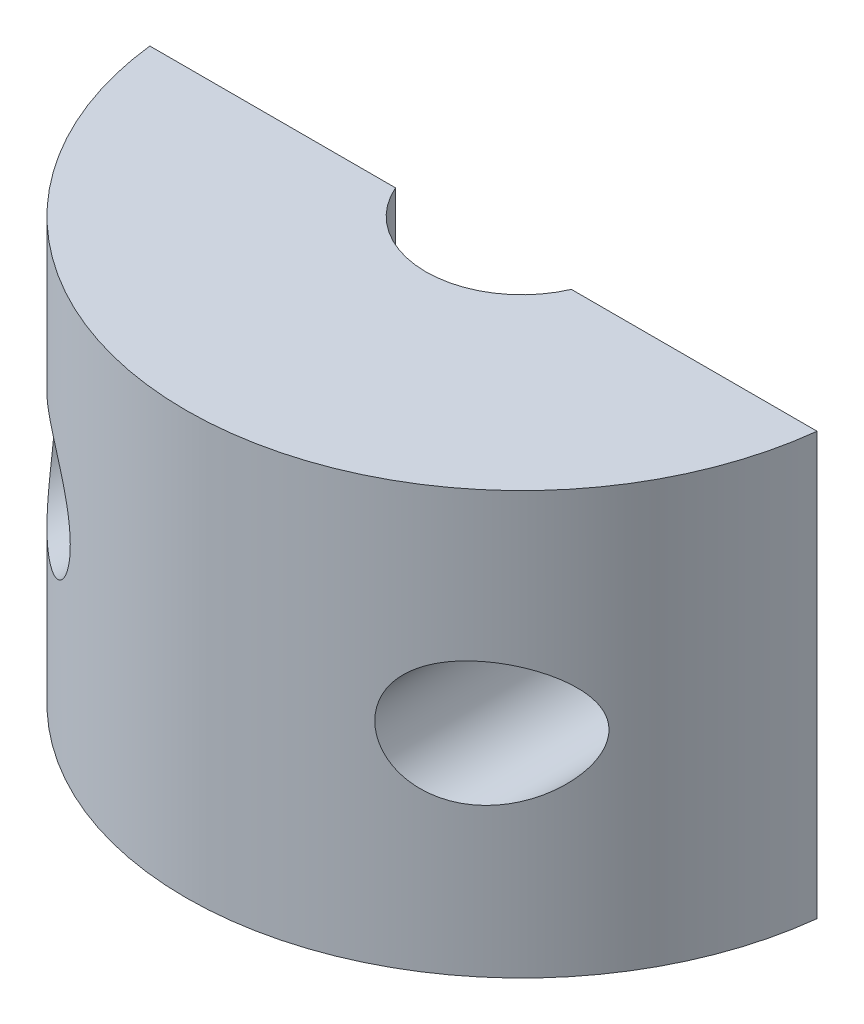
ISO-10303-21;
HEADER;
FILE_DESCRIPTION(('STEP AP214'),'2;1');
FILE_NAME('part.step','',(''),(''),'','','');
FILE_SCHEMA(('AUTOMOTIVE_DESIGN { 1 0 10303 214 1 1 1 1 }'));
ENDSEC;
DATA;
#1=APPLICATION_CONTEXT('core data for automotive mechanical design processes');
#2=APPLICATION_PROTOCOL_DEFINITION('international standard','automotive_design',2000,#1);
#3=PRODUCT_CONTEXT('',#1,'mechanical');
#4=PRODUCT('Part','Part','',(#3));
#5=PRODUCT_RELATED_PRODUCT_CATEGORY('part','',(#4));
#6=PRODUCT_DEFINITION_FORMATION('','',#4);
#7=PRODUCT_DEFINITION_CONTEXT('part definition',#1,'design');
#8=PRODUCT_DEFINITION('design','',#6,#7);
#9=PRODUCT_DEFINITION_SHAPE('','',#8);
#10=(LENGTH_UNIT() NAMED_UNIT(*) SI_UNIT(.MILLI.,.METRE.));
#11=(NAMED_UNIT(*) PLANE_ANGLE_UNIT() SI_UNIT($,.RADIAN.));
#12=(NAMED_UNIT(*) SI_UNIT($,.STERADIAN.) SOLID_ANGLE_UNIT());
#13=UNCERTAINTY_MEASURE_WITH_UNIT(LENGTH_MEASURE(1.E-05),#10,'distance_accuracy_value','');
#14=(GEOMETRIC_REPRESENTATION_CONTEXT(3) GLOBAL_UNCERTAINTY_ASSIGNED_CONTEXT((#13)) GLOBAL_UNIT_ASSIGNED_CONTEXT((#10,
#11,#12)) REPRESENTATION_CONTEXT('',''));
#15=CARTESIAN_POINT('',(0.,0.,0.));
#16=DIRECTION('',(0.,0.,1.));
#17=DIRECTION('',(1.,0.,0.));
#18=AXIS2_PLACEMENT_3D('',#15,#16,#17);
#19=CARTESIAN_POINT('',(0.,22.,0.));
#20=DIRECTION('',(0.,-1.,0.));
#21=DIRECTION('',(0.,0.,-1.));
#22=AXIS2_PLACEMENT_3D('',#19,#20,#21);
#23=CYLINDRICAL_SURFACE('',#22,17.5);
#24=CARTESIAN_POINT('',(-14.4351923476113,11.,9.89319068286191));
#25=CARTESIAN_POINT('',(-14.4351854063643,11.1107214320319,9.89320253763242));
#26=CARTESIAN_POINT('',(-14.4294784286159,11.2215070622987,9.90154375625472));
#27=CARTESIAN_POINT('',(-14.4071932160093,11.4396534645998,9.9339388034283));
#28=CARTESIAN_POINT('',(-14.3905997840602,11.5470092286437,9.95801459668769));
#29=CARTESIAN_POINT('',(-14.3425687854503,11.7817811831064,10.0271074274855));
#30=CARTESIAN_POINT('',(-14.3084640688859,11.9075374235435,10.0758457983632));
#31=CARTESIAN_POINT('',(-14.2283748609078,12.1479047446293,10.1886261603085));
#32=CARTESIAN_POINT('',(-14.1823661067574,12.2624923970377,10.2526993865471));
#33=CARTESIAN_POINT('',(-14.0926921173052,12.4551543024337,10.3754721567712));
#34=CARTESIAN_POINT('',(-14.0509354802768,12.5355530820995,10.4320005711661));
#35=CARTESIAN_POINT('',(-13.962666159549,12.6899860230746,10.5498516627541));
#36=CARTESIAN_POINT('',(-13.9161521533778,12.7640184040424,10.6111756719238));
#37=CARTESIAN_POINT('',(-13.8188947862182,12.9061858185024,10.7375285346047));
#38=CARTESIAN_POINT('',(-13.7681429101692,12.974308389331,10.8025647598407));
#39=CARTESIAN_POINT('',(-13.6629600269906,13.1048006896623,10.9352960283987));
#40=CARTESIAN_POINT('',(-13.6085300125415,13.1671719607038,11.0029903522855));
#41=CARTESIAN_POINT('',(-13.4683727042353,13.3161702380928,11.1745493874523));
#42=CARTESIAN_POINT('',(-13.3805511107422,13.3994200371177,11.2796481942207));
#43=CARTESIAN_POINT('',(-13.1981683269466,13.5543581876393,11.4925206327793));
#44=CARTESIAN_POINT('',(-13.1036040652739,13.6260412211883,11.600295468777));
#45=CARTESIAN_POINT('',(-12.9082612534243,13.7581596361268,11.8172804658417));
#46=CARTESIAN_POINT('',(-12.8074777447167,13.8185858842577,11.9264917161068));
#47=CARTESIAN_POINT('',(-12.6002695952139,13.9281025678747,12.1452006861663));
#48=CARTESIAN_POINT('',(-12.4938458595144,13.9771948154135,12.2546983573334));
#49=CARTESIAN_POINT('',(-12.273720261481,14.0646199896123,12.4751960410589));
#50=CARTESIAN_POINT('',(-12.1599182615054,14.1027297009474,12.5861848442722));
#51=CARTESIAN_POINT('',(-11.9274492318936,14.166398633305,12.8067024913441));
#52=CARTESIAN_POINT('',(-11.8087815824089,14.1919562498655,12.9162311468205));
#53=CARTESIAN_POINT('',(-11.5674239622345,14.2297510361998,13.1328190172241));
#54=CARTESIAN_POINT('',(-11.4447400583483,14.2420074211921,13.2398815751321));
#55=CARTESIAN_POINT('',(-11.1961268689162,14.2523623989087,13.4507749315319));
#56=CARTESIAN_POINT('',(-11.0701987148926,14.250465862983,13.5546068296421));
#57=CARTESIAN_POINT('',(-10.7527915399378,14.2267534099336,13.8089367537417));
#58=CARTESIAN_POINT('',(-10.5598815683915,14.1954932039982,13.956940188805));
#59=CARTESIAN_POINT('',(-10.1746365931386,14.0952890061681,14.2402184766604));
#60=CARTESIAN_POINT('',(-9.98230116910394,14.0263935048131,14.3755094462824));
#61=CARTESIAN_POINT('',(-9.63677139876624,13.8627060510807,14.6088551469129));
#62=CARTESIAN_POINT('',(-9.48236287193662,13.7740781832204,14.7093681878592));
#63=CARTESIAN_POINT('',(-9.259410784157,13.6195561896128,14.8499532052958));
#64=CARTESIAN_POINT('',(-9.18650510171574,13.564421604664,14.8951360251197));
#65=CARTESIAN_POINT('',(-9.04438253994854,13.4470217157696,14.981857394852));
#66=CARTESIAN_POINT('',(-8.9751640639982,13.3847595355862,15.0233975272263));
#67=CARTESIAN_POINT('',(-8.84076604869028,13.252798437034,15.1028806141716));
#68=CARTESIAN_POINT('',(-8.77561953121894,13.1830487437715,15.1407952213938));
#69=CARTESIAN_POINT('',(-8.65083504177582,13.0368511307601,15.2124365837774));
#70=CARTESIAN_POINT('',(-8.59119434513602,12.9604065610038,15.2461654132327));
#71=CARTESIAN_POINT('',(-8.47827425210696,12.8012803640893,15.3092472301404));
#72=CARTESIAN_POINT('',(-8.42499381273417,12.7185997631822,15.338600935242));
#73=CARTESIAN_POINT('',(-8.32562283337006,12.5476223779358,15.3927648329195));
#74=CARTESIAN_POINT('',(-8.27953125484091,12.4593264074195,15.4175756818687));
#75=CARTESIAN_POINT('',(-8.20041631975081,12.2889271572136,15.459784330797));
#76=CARTESIAN_POINT('',(-8.16648544205924,12.2073761214638,15.4777166616643));
#77=CARTESIAN_POINT('',(-8.10518339732691,12.0411044567527,15.5099065641261));
#78=CARTESIAN_POINT('',(-8.07781450742864,11.9563827392577,15.5241628601912));
#79=CARTESIAN_POINT('',(-8.03004534063454,11.7845315469674,15.548925998733));
#80=CARTESIAN_POINT('',(-8.00963931492149,11.6974041229846,15.5594359346754));
#81=CARTESIAN_POINT('',(-7.97603487735773,11.5213952062193,15.5766881114068));
#82=CARTESIAN_POINT('',(-7.96283898467137,11.4325131115926,15.5834290353514));
#83=CARTESIAN_POINT('',(-7.935849714781,11.1781041564069,15.597203738062));
#84=CARTESIAN_POINT('',(-7.93097083492752,11.0112669297195,15.5996732359099));
#85=CARTESIAN_POINT('',(-7.94678588648249,10.679246435926,15.591621087927));
#86=CARTESIAN_POINT('',(-7.96747446984696,10.5140628302107,15.5811021589354));
#87=CARTESIAN_POINT('',(-8.03278778712706,10.1930528328736,15.5475278933696));
#88=CARTESIAN_POINT('',(-8.07696145062517,10.0371097134103,15.5247086931686));
#89=CARTESIAN_POINT('',(-8.18697929547645,9.73548320717321,15.4669713431335));
#90=CARTESIAN_POINT('',(-8.25282434584583,9.58980023211254,15.4320527081126));
#91=CARTESIAN_POINT('',(-8.40541554355062,9.30835839640948,15.3494847336182));
#92=CARTESIAN_POINT('',(-8.49267882995274,9.17297452151927,15.3015166140438));
#93=CARTESIAN_POINT('',(-8.68345653237575,8.91936967475263,15.1940629680102));
#94=CARTESIAN_POINT('',(-8.78697470503784,8.80115268247385,15.1345747784225));
#95=CARTESIAN_POINT('',(-9.01460641692163,8.57541059941235,15.0001857732254));
#96=CARTESIAN_POINT('',(-9.13968151182539,8.46934786246623,14.9244646634116));
#97=CARTESIAN_POINT('',(-9.39947415453385,8.27977752804582,14.7622277628207));
#98=CARTESIAN_POINT('',(-9.53419565345356,8.19627924047403,14.6757075378761));
#99=CARTESIAN_POINT('',(-9.82701367482364,8.0421871567348,14.4815216770973));
#100=CARTESIAN_POINT('',(-9.98587360724224,7.97467775263719,14.3725691627529));
#101=CARTESIAN_POINT('',(-10.3057473036486,7.86669080919712,14.1449714206699));
#102=CARTESIAN_POINT('',(-10.4667622530218,7.82622882800746,14.0263206582868));
#103=CARTESIAN_POINT('',(-10.8166883897497,7.7652249368534,13.7588563913282));
#104=CARTESIAN_POINT('',(-11.0052943945565,7.74970348732925,13.6085042943301));
#105=CARTESIAN_POINT('',(-11.3760015204793,7.75030566434481,13.3001856294852));
#106=CARTESIAN_POINT('',(-11.5580986583065,7.76644834212918,13.1422145333223));
#107=CARTESIAN_POINT('',(-11.9504672227586,7.83386494298812,12.7874940529666));
#108=CARTESIAN_POINT('',(-12.1585824462431,7.89182927950208,12.5895919477833));
#109=CARTESIAN_POINT('',(-12.4578316436077,8.0076177544317,12.291155076363));
#110=CARTESIAN_POINT('',(-12.5555258196523,8.05108341829937,12.1913035980314));
#111=CARTESIAN_POINT('',(-12.746264878531,8.14746341470471,11.9917356548291));
#112=CARTESIAN_POINT('',(-12.8393113807686,8.20037442636145,11.892019154877));
#113=CARTESIAN_POINT('',(-13.0166878425667,8.31323236964329,11.6975406775821));
#114=CARTESIAN_POINT('',(-13.1012186813075,8.37280279853969,11.6027429300452));
#115=CARTESIAN_POINT('',(-13.2653357327723,8.50073374412333,11.4147462537791));
#116=CARTESIAN_POINT('',(-13.3449209404991,8.56909603879069,11.3215476527785));
#117=CARTESIAN_POINT('',(-13.4985179433951,8.71478413120341,11.1379667889636));
#118=CARTESIAN_POINT('',(-13.5725399447209,8.79209281946238,11.0475795564276));
#119=CARTESIAN_POINT('',(-13.7144904303988,8.95624923670396,10.8708595605261));
#120=CARTESIAN_POINT('',(-13.7824227555214,9.04309087523955,10.7845242582083));
#121=CARTESIAN_POINT('',(-13.9200270558531,9.23947509513177,10.6064661015993));
#122=CARTESIAN_POINT('',(-13.9887009008908,9.35049983555399,10.515583901735));
#123=CARTESIAN_POINT('',(-14.1149873661338,9.58694726919966,10.3454492906101));
#124=CARTESIAN_POINT('',(-14.172612227197,9.71235378011671,10.2661840324876));
#125=CARTESIAN_POINT('',(-14.2628104886524,9.94964661760273,10.1403605347467));
#126=CARTESIAN_POINT('',(-14.2981059311719,10.058681304546,10.090433081001));
#127=CARTESIAN_POINT('',(-14.3577496499499,10.2851616564625,10.0053859065639));
#128=CARTESIAN_POINT('',(-14.3821238566285,10.4025866226469,9.97023112342441));
#129=CARTESIAN_POINT('',(-14.4115369458183,10.6007423496649,9.92763876335556));
#130=CARTESIAN_POINT('',(-14.4203650256941,10.6797704720225,9.91479615307472));
#131=CARTESIAN_POINT('',(-14.4321951424213,10.83918780558,9.89756795996659));
#132=CARTESIAN_POINT('',(-14.4351973894186,10.9195769675798,9.89318207209364));
#133=CARTESIAN_POINT('',(-14.4351923476113,11.,9.89319068286191));
#134=B_SPLINE_CURVE_WITH_KNOTS('',3,(#24,#25,#26,#27,#28,#29,#30,#31,#32,#33,#34,#35,#36,#37,
#38,#39,#40,#41,#42,#43,#44,#45,#46,#47,#48,#49,#50,#51,#52,#53,#54,#55,#56,#57,#58,#59,#60,#61,
#62,#63,#64,#65,#66,#67,#68,#69,#70,#71,#72,#73,#74,#75,#76,#77,#78,#79,#80,#81,#82,#83,#84,#85,
#86,#87,#88,#89,#90,#91,#92,#93,#94,#95,#96,#97,#98,#99,#100,#101,#102,#103,#104,#105,#106,#107,
#108,#109,#110,#111,#112,#113,#114,#115,#116,#117,#118,#119,#120,#121,#122,#123,#124,#125,#126,
#127,#128,#129,#130,#131,#132,#133),.UNSPECIFIED.,.T.,.F.,(4,2,2,2,2,2,2,2,2,2,2,2,2,2,2,2,2,2,
2,2,2,2,2,2,2,2,2,2,2,2,2,2,2,2,2,2,2,2,2,2,2,2,2,2,2,2,2,2,2,2,2,2,2,2,4),(0.,
0.331841777553161,0.664147782553581,1.07918635593908,1.49507761526165,1.81501070213257,
2.13503296821189,2.45571447830309,2.77630978374778,3.25646192337981,3.73683419308992,
4.21759453411038,4.69827795901732,5.18813494026946,5.67805452083019,6.1672654080098,
6.65630791952205,7.38875217148992,8.12025493667895,8.73082685509704,9.03639611333956,
9.34183196086879,9.64948835243722,9.95699166851571,10.2644444893474,10.5718528528254,
10.8418867678276,11.1120142548696,11.3819181711904,11.651916329634,12.1500277791255,
12.6480350543751,13.1368055882578,13.6255957240829,14.1276060370096,14.6297325399713,
15.16943881887,15.709367437247,16.319419481259,16.929822136653,17.6522807491886,
18.3751741742021,19.2505064478331,19.68911988644,20.127579416002,20.5480973270221,
20.9687004135522,21.3885120144988,21.8080569486807,22.2841118195113,22.7596361960016,
23.1333765390797,23.5062247417869,23.7472682711249,23.9883031055268),.UNSPECIFIED.);
#135=CARTESIAN_POINT('',(-14.4351923476113,11.,9.89319068286191));
#136=VERTEX_POINT('',#135);
#137=EDGE_CURVE('E156',#136,#136,#134,.T.);
#138=ORIENTED_EDGE('',*,*,#137,.T.);
#139=EDGE_LOOP('',(#138));
#140=FACE_BOUND('',#139,.T.);
#141=CARTESIAN_POINT('',(7.93519234761125,11.,15.5975229573933));
#142=CARTESIAN_POINT('',(7.93520223225111,11.1663008509199,15.5975201691559));
#143=CARTESIAN_POINT('',(7.94801924887635,11.3326952487626,15.5910177749907));
#144=CARTESIAN_POINT('',(7.99871770765295,11.6606575606445,15.5650663881711));
#145=CARTESIAN_POINT('',(8.03661986040183,11.8222213711959,15.5456066977327));
#146=CARTESIAN_POINT('',(8.13562285875437,12.1355927563694,15.4940222551571));
#147=CARTESIAN_POINT('',(8.1966819168378,12.2874173322096,15.4619203124639));
#148=CARTESIAN_POINT('',(8.33924173363641,12.5777291413689,15.3854982028003));
#149=CARTESIAN_POINT('',(8.42074073091744,12.7162175225267,15.3411790886254));
#150=CARTESIAN_POINT('',(8.60338210872824,12.9807414338087,15.239521496784));
#151=CARTESIAN_POINT('',(8.70502768836727,13.1062964988478,15.1818412715208));
#152=CARTESIAN_POINT('',(8.92224709621971,13.3381279176726,15.0552085795871));
#153=CARTESIAN_POINT('',(9.03782484503702,13.4443988235921,14.9862529379851));
#154=CARTESIAN_POINT('',(9.29028571268866,13.6458106719126,14.8312005636125));
#155=CARTESIAN_POINT('',(9.42814987859592,13.7389414250228,14.7440985614854));
#156=CARTESIAN_POINT('',(9.710881668285,13.9009483680662,14.559441693929));
#157=CARTESIAN_POINT('',(9.85575276943386,13.9698123716014,14.461881608588));
#158=CARTESIAN_POINT('',(10.1705063195897,14.0928301443012,14.2426415094532));
#159=CARTESIAN_POINT('',(10.340869496489,14.1432062114129,14.1195418036492));
#160=CARTESIAN_POINT('',(10.680739260021,14.2153159065865,13.8642385951983));
#161=CARTESIAN_POINT('',(10.8502453571317,14.2370346816896,13.7320304089837));
#162=CARTESIAN_POINT('',(11.2182405218156,14.2560360633624,13.4338256065968));
#163=CARTESIAN_POINT('',(11.4158025535153,14.2476112572725,13.2663318893554));
#164=CARTESIAN_POINT('',(11.800994196086,14.1970444164128,12.9248946738883));
#165=CARTESIAN_POINT('',(11.9886128963881,14.1548661293861,12.7509444328217));
#166=CARTESIAN_POINT('',(12.2790581525692,14.0625300771634,12.4698811529349));
#167=CARTESIAN_POINT('',(12.3859825958537,14.0221840928671,12.363643424221));
#168=CARTESIAN_POINT('',(12.594811795476,13.9306103114868,12.1508402857757));
#169=CARTESIAN_POINT('',(12.6967153615086,13.8793799491768,12.0442748046447));
#170=CARTESIAN_POINT('',(12.8950461272085,13.7662140457282,11.831691016722));
#171=CARTESIAN_POINT('',(12.9914726364202,13.704277158852,11.7256727804424));
#172=CARTESIAN_POINT('',(13.1783170092118,13.5696703217789,11.5152848134878));
#173=CARTESIAN_POINT('',(13.2687369316276,13.4970040770197,11.410914527405));
#174=CARTESIAN_POINT('',(13.4797746745605,13.3076250769985,11.1616401902205));
#175=CARTESIAN_POINT('',(13.5971160426654,13.1852346410934,11.0181326589505));
#176=CARTESIAN_POINT('',(13.7611787911467,12.9834990895822,10.8114643636482));
#177=CARTESIAN_POINT('',(13.8138538379395,12.9132645460574,10.7440354651223));
#178=CARTESIAN_POINT('',(13.9147567683611,12.7663298726328,10.6130278597404));
#179=CARTESIAN_POINT('',(13.9629864533935,12.689632386059,10.5494475969107));
#180=CARTESIAN_POINT('',(14.0694229437574,12.5029229528564,10.4072849492391));
#181=CARTESIAN_POINT('',(14.1256822967263,12.3902598545314,10.3306605689882));
#182=CARTESIAN_POINT('',(14.2268551678788,12.1521501120007,10.190879805641));
#183=CARTESIAN_POINT('',(14.2717868438797,12.0267243847342,10.1277018940458));
#184=CARTESIAN_POINT('',(14.33863206264,11.7934225841623,10.0327577056476));
#185=CARTESIAN_POINT('',(14.3634525871098,11.6879838479109,9.99711947063219));
#186=CARTESIAN_POINT('',(14.4027017087785,11.4713829241865,9.94049239841689));
#187=CARTESIAN_POINT('',(14.4171429716588,11.3602278904268,9.91948570750029));
#188=CARTESIAN_POINT('',(14.4343974593198,11.1343634276012,9.89436336448938));
#189=CARTESIAN_POINT('',(14.4371383728595,11.0196362964191,9.89035275375021));
#190=CARTESIAN_POINT('',(14.4304955065021,10.7912789512582,9.9000417396064));
#191=CARTESIAN_POINT('',(14.4211081214528,10.6776490735564,9.91374660214931));
#192=CARTESIAN_POINT('',(14.3924440191833,10.4646341227199,9.95530531812541));
#193=CARTESIAN_POINT('',(14.3740769571899,10.3648597651408,9.98185571323572));
#194=CARTESIAN_POINT('',(14.3292477547152,10.1709439515683,10.0461035060648));
#195=CARTESIAN_POINT('',(14.3027823737268,10.0768047685274,10.0838053657916));
#196=CARTESIAN_POINT('',(14.2240573851278,9.83710527854222,10.194765265026));
#197=CARTESIAN_POINT('',(14.1660898320053,9.6968508288238,10.2753993274064));
#198=CARTESIAN_POINT('',(14.0363775670007,9.4331644921972,10.4518974794019));
#199=CARTESIAN_POINT('',(13.9645869580213,9.30979105797705,10.5478121171346));
#200=CARTESIAN_POINT('',(13.8261002536034,9.1025696098547,10.7284272203556));
#201=CARTESIAN_POINT('',(13.7613944971722,9.01581174880905,10.8113753131008));
#202=CARTESIAN_POINT('',(13.6260309519433,8.85147702370634,10.9814888234531));
#203=CARTESIAN_POINT('',(13.5553697073546,8.77390555389857,11.0686566770008));
#204=CARTESIAN_POINT('',(13.4087402512968,8.62743287967754,11.2458402734161));
#205=CARTESIAN_POINT('',(13.3327691802379,8.55853640398308,11.3358575363235));
#206=CARTESIAN_POINT('',(13.1760314393383,8.42912745025592,11.5176649429422));
#207=CARTESIAN_POINT('',(13.0952656055262,8.36861351671702,11.6094547757109));
#208=CARTESIAN_POINT('',(12.9251302489491,8.25296261617052,11.7986428918323));
#209=CARTESIAN_POINT('',(12.8355325173118,8.19824448339243,11.8960925280111));
#210=CARTESIAN_POINT('',(12.6517721793507,8.09782619476383,12.0913479220159));
#211=CARTESIAN_POINT('',(12.5576078483503,8.05212947961367,12.1891538012822));
#212=CARTESIAN_POINT('',(12.2686255655355,7.92875196510571,12.4822188824029));
#213=CARTESIAN_POINT('',(12.0672905901719,7.86476500226431,12.6771565782291));
#214=CARTESIAN_POINT('',(11.7357001692838,7.79448137031678,12.9827467305139));
#215=CARTESIAN_POINT('',(11.6098529770485,7.77530493379413,13.0954227179303));
#216=CARTESIAN_POINT('',(11.3540589431672,7.75184983148799,13.3178078547708));
#217=CARTESIAN_POINT('',(11.2241110341395,7.7475750773045,13.4275162177142));
#218=CARTESIAN_POINT('',(10.9615670810603,7.75504979463264,13.6426830181417));
#219=CARTESIAN_POINT('',(10.8289765711799,7.7667686644202,13.7481491754001));
#220=CARTESIAN_POINT('',(10.5625196069028,7.80736351222349,13.9539065472053));
#221=CARTESIAN_POINT('',(10.4286540328137,7.83622839337043,14.0542010632423));
#222=CARTESIAN_POINT('',(10.122663537861,7.92336946067184,14.2767994559453));
#223=CARTESIAN_POINT('',(9.95071355814063,7.98775126084035,14.3970402097561));
#224=CARTESIAN_POINT('',(9.61342486039852,8.14923057611804,14.6244085490398));
#225=CARTESIAN_POINT('',(9.44808180086689,8.24630619855593,14.7315448443424));
#226=CARTESIAN_POINT('',(9.20993860894632,8.41725390890858,14.8807265683768));
#227=CARTESIAN_POINT('',(9.13185942319227,8.47880887627705,14.9287313950096));
#228=CARTESIAN_POINT('',(8.98030017584483,8.61023204747677,15.0203867004276));
#229=CARTESIAN_POINT('',(8.90681778079971,8.68009598033652,15.0640393952623));
#230=CARTESIAN_POINT('',(8.7655313753115,8.82785971078159,15.1466884229079));
#231=CARTESIAN_POINT('',(8.69772715230918,8.90575920731619,15.1856849300438));
#232=CARTESIAN_POINT('',(8.56890107359257,9.06911099296576,15.2587488750279));
#233=CARTESIAN_POINT('',(8.50787787425827,9.15456177979128,15.2928172897538));
#234=CARTESIAN_POINT('',(8.40149159831192,9.32016942322888,15.3514856423518));
#235=CARTESIAN_POINT('',(8.35512813421801,9.39945284237414,15.3767432909116));
#236=CARTESIAN_POINT('',(8.2688896292563,9.56257627453449,15.4232897188728));
#237=CARTESIAN_POINT('',(8.22901358301815,9.64641557882178,15.4445791133184));
#238=CARTESIAN_POINT('',(8.15637213462928,9.81788190282446,15.4830644257194));
#239=CARTESIAN_POINT('',(8.12359665823485,9.90550334182137,15.5002661466445));
#240=CARTESIAN_POINT('',(8.06557964082688,10.0838592566416,15.5305342098214));
#241=CARTESIAN_POINT('',(8.04033575995389,10.1745927558458,15.5436018364988));
#242=CARTESIAN_POINT('',(7.99134399574869,10.3860964595433,15.5688603967501));
#243=CARTESIAN_POINT('',(7.97033164153044,10.5076899450158,15.5796044940331));
#244=CARTESIAN_POINT('',(7.94225297255541,10.752838550182,15.5939363853849));
#245=CARTESIAN_POINT('',(7.93518500064717,10.8763934350236,15.5975250298088));
#246=CARTESIAN_POINT('',(7.93519234761125,11.,15.5975229573933));
#247=B_SPLINE_CURVE_WITH_KNOTS('',3,(#141,#142,#143,#144,#145,#146,#147,#148,#149,#150,#151,
#152,#153,#154,#155,#156,#157,#158,#159,#160,#161,#162,#163,#164,#165,#166,#167,#168,#169,#170,
#171,#172,#173,#174,#175,#176,#177,#178,#179,#180,#181,#182,#183,#184,#185,#186,#187,#188,#189,
#190,#191,#192,#193,#194,#195,#196,#197,#198,#199,#200,#201,#202,#203,#204,#205,#206,#207,#208,
#209,#210,#211,#212,#213,#214,#215,#216,#217,#218,#219,#220,#221,#222,#223,#224,#225,#226,#227,
#228,#229,#230,#231,#232,#233,#234,#235,#236,#237,#238,#239,#240,#241,#242,#243,#244,#245,#246),
.UNSPECIFIED.,.T.,.F.,(4,2,2,2,2,2,2,2,2,2,2,2,2,2,2,2,2,2,2,2,2,2,2,2,2,2,2,2,2,2,2,2,2,2,2,2,
2,2,2,2,2,2,2,2,2,2,2,2,2,2,2,2,4),(0.,0.498453678896544,0.997319401514348,1.4952891525275,
1.993216005188,2.50565227741341,3.01823309069454,3.57940669399388,4.14086171000066,
4.78687945877223,5.43323190458346,6.20790612524668,6.98341348786526,7.45111455428762,
7.91892597084045,8.38679623093471,8.8545052859896,9.51874916600297,9.8505730893743,
10.1822619503306,10.6232210619989,11.0634687739221,11.4042507151125,11.7446160950899,
12.0870820046557,12.4296497360733,12.7430622838152,13.0566004065857,13.5692306301292,
14.083593258323,14.4921380041935,14.9009214703756,15.3099268075874,15.7188610377284,
16.1481954724954,16.5776933371621,17.4365531597467,17.9459802968659,18.4555411454111,
18.9641283810655,19.4723868180258,20.1281956423716,20.7835661895905,21.1143762932074,
21.4450170829442,21.7756454897887,22.1062082672995,22.3915774736711,22.6769024134943,
22.9618198457459,23.2466486695999,23.617178766176,23.9876648262741),.UNSPECIFIED.);
#248=CARTESIAN_POINT('',(7.93519234761125,11.,15.5975229573933));
#249=VERTEX_POINT('',#248);
#250=EDGE_CURVE('E102',#249,#249,#247,.T.);
#251=ORIENTED_EDGE('',*,*,#250,.T.);
#252=EDGE_LOOP('',(#251));
#253=FACE_BOUND('',#252,.T.);
#254=CARTESIAN_POINT('',(0.,22.,0.));
#255=DIRECTION('',(0.,1.,0.));
#256=DIRECTION('',(0.,0.,1.));
#257=AXIS2_PLACEMENT_3D('',#254,#255,#256);
#258=CIRCLE('',#257,17.5);
#259=CARTESIAN_POINT('',(-17.3853386507137,22.,2.));
#260=VERTEX_POINT('',#259);
#261=CARTESIAN_POINT('',(17.3853386507137,22.,2.));
#262=VERTEX_POINT('',#261);
#263=EDGE_CURVE('E42',#260,#262,#258,.T.);
#264=ORIENTED_EDGE('',*,*,#263,.F.);
#265=DIRECTION('',(0.,-1.,0.));
#266=VECTOR('',#265,1.);
#267=CARTESIAN_POINT('',(-17.3853386507137,22.,2.));
#268=LINE('',#267,#266);
#269=CARTESIAN_POINT('',(-17.3853386507137,0.,2.));
#270=VERTEX_POINT('',#269);
#271=EDGE_CURVE('E74',#260,#270,#268,.T.);
#272=ORIENTED_EDGE('',*,*,#271,.T.);
#273=CARTESIAN_POINT('',(0.,0.,0.));
#274=DIRECTION('',(0.,1.,0.));
#275=DIRECTION('',(0.,0.,1.));
#276=AXIS2_PLACEMENT_3D('',#273,#274,#275);
#277=CIRCLE('',#276,17.5);
#278=CARTESIAN_POINT('',(17.3853386507137,0.,2.));
#279=VERTEX_POINT('',#278);
#280=EDGE_CURVE('E96',#270,#279,#277,.T.);
#281=ORIENTED_EDGE('',*,*,#280,.T.);
#282=DIRECTION('',(0.,-1.,0.));
#283=VECTOR('',#282,1.);
#284=CARTESIAN_POINT('',(17.3853386507137,22.,2.));
#285=LINE('',#284,#283);
#286=EDGE_CURVE('E58',#279,#262,#285,.F.);
#287=ORIENTED_EDGE('',*,*,#286,.T.);
#288=EDGE_LOOP('',(#264,#272,#281,#287));
#289=FACE_BOUND('',#288,.T.);
#290=ADVANCED_FACE('F33',(#140,#253,#289),#23,.T.);
#291=CARTESIAN_POINT('',(0.,22.,0.));
#292=DIRECTION('',(0.,-1.,0.));
#293=DIRECTION('',(0.,0.,-1.));
#294=AXIS2_PLACEMENT_3D('',#291,#292,#293);
#295=CYLINDRICAL_SURFACE('',#294,5.);
#296=CARTESIAN_POINT('',(0.,0.,0.));
#297=DIRECTION('',(0.,-1.,0.));
#298=DIRECTION('',(0.,0.,1.));
#299=AXIS2_PLACEMENT_3D('',#296,#297,#298);
#300=CIRCLE('',#299,5.);
#301=CARTESIAN_POINT('',(4.58257569495584,0.,2.));
#302=VERTEX_POINT('',#301);
#303=CARTESIAN_POINT('',(-4.58257569495584,0.,2.));
#304=VERTEX_POINT('',#303);
#305=EDGE_CURVE('E93',#302,#304,#300,.T.);
#306=ORIENTED_EDGE('',*,*,#305,.T.);
#307=DIRECTION('',(0.,-1.,0.));
#308=VECTOR('',#307,1.);
#309=CARTESIAN_POINT('',(-4.58257569495584,22.,2.));
#310=LINE('',#309,#308);
#311=CARTESIAN_POINT('',(-4.58257569495584,22.,2.));
#312=VERTEX_POINT('',#311);
#313=EDGE_CURVE('E50',#304,#312,#310,.F.);
#314=ORIENTED_EDGE('',*,*,#313,.T.);
#315=CARTESIAN_POINT('',(0.,22.,0.));
#316=DIRECTION('',(0.,-1.,0.));
#317=DIRECTION('',(0.,0.,1.));
#318=AXIS2_PLACEMENT_3D('',#315,#316,#317);
#319=CIRCLE('',#318,5.);
#320=CARTESIAN_POINT('',(4.58257569495584,22.,2.));
#321=VERTEX_POINT('',#320);
#322=EDGE_CURVE('E11',#321,#312,#319,.T.);
#323=ORIENTED_EDGE('',*,*,#322,.F.);
#324=DIRECTION('',(0.,-1.,0.));
#325=VECTOR('',#324,1.);
#326=CARTESIAN_POINT('',(4.58257569495584,22.,2.));
#327=LINE('',#326,#325);
#328=EDGE_CURVE('E143',#321,#302,#327,.T.);
#329=ORIENTED_EDGE('',*,*,#328,.T.);
#330=EDGE_LOOP('',(#306,#314,#323,#329));
#331=FACE_BOUND('',#330,.T.);
#332=ADVANCED_FACE('F132',(#331),#295,.F.);
#333=CARTESIAN_POINT('',(0.,22.,0.));
#334=DIRECTION('',(0.,1.,0.));
#335=DIRECTION('',(0.,0.,1.));
#336=AXIS2_PLACEMENT_3D('',#333,#334,#335);
#337=PLANE('',#336);
#338=DIRECTION('',(1.,0.,0.));
#339=VECTOR('',#338,1.);
#340=CARTESIAN_POINT('',(-17.4714052096561,22.,2.));
#341=LINE('',#340,#339);
#342=EDGE_CURVE('E77',#260,#312,#341,.T.);
#343=ORIENTED_EDGE('',*,*,#342,.F.);
#344=ORIENTED_EDGE('',*,*,#263,.T.);
#345=EDGE_CURVE('E91',#321,#262,#341,.T.);
#346=ORIENTED_EDGE('',*,*,#345,.F.);
#347=ORIENTED_EDGE('',*,*,#322,.T.);
#348=EDGE_LOOP('',(#343,#344,#346,#347));
#349=FACE_BOUND('',#348,.T.);
#350=ADVANCED_FACE('F87',(#349),#337,.T.);
#351=CARTESIAN_POINT('',(0.,0.,0.));
#352=DIRECTION('',(0.,1.,0.));
#353=DIRECTION('',(0.,0.,1.));
#354=AXIS2_PLACEMENT_3D('',#351,#352,#353);
#355=PLANE('',#354);
#356=ORIENTED_EDGE('',*,*,#280,.F.);
#357=DIRECTION('',(1.,0.,0.));
#358=VECTOR('',#357,1.);
#359=CARTESIAN_POINT('',(-17.4714052096561,0.,2.));
#360=LINE('',#359,#358);
#361=EDGE_CURVE('E78',#270,#304,#360,.T.);
#362=ORIENTED_EDGE('',*,*,#361,.T.);
#363=ORIENTED_EDGE('',*,*,#305,.F.);
#364=EDGE_CURVE('E90',#302,#279,#360,.T.);
#365=ORIENTED_EDGE('',*,*,#364,.T.);
#366=EDGE_LOOP('',(#356,#362,#363,#365));
#367=FACE_BOUND('',#366,.T.);
#368=ADVANCED_FACE('F128',(#367),#355,.F.);
#369=CARTESIAN_POINT('',(-11.1851923476112,11.,23.));
#370=DIRECTION('',(0.,0.,-1.));
#371=DIRECTION('',(-1.,0.,0.));
#372=AXIS2_PLACEMENT_3D('',#369,#370,#371);
#373=CYLINDRICAL_SURFACE('',#372,1.75);
#374=CARTESIAN_POINT('',(-11.1851923476113,11.,2.));
#375=DIRECTION('',(0.,0.,1.));
#376=DIRECTION('',(1.,0.,0.));
#377=AXIS2_PLACEMENT_3D('',#374,#375,#376);
#378=CIRCLE('',#377,1.75);
#379=CARTESIAN_POINT('',(-9.43519234761125,11.,2.));
#380=VERTEX_POINT('',#379);
#381=EDGE_CURVE('E146',#380,#380,#378,.F.);
#382=ORIENTED_EDGE('',*,*,#381,.T.);
#383=EDGE_LOOP('',(#382));
#384=FACE_BOUND('',#383,.T.);
#385=CARTESIAN_POINT('',(-11.1851923476113,11.,5.));
#386=DIRECTION('',(0.,0.,-1.));
#387=DIRECTION('',(-1.,0.,0.));
#388=AXIS2_PLACEMENT_3D('',#385,#386,#387);
#389=CIRCLE('',#388,1.75);
#390=CARTESIAN_POINT('',(-12.9351923476113,11.,5.));
#391=VERTEX_POINT('',#390);
#392=EDGE_CURVE('E112',#391,#391,#389,.F.);
#393=ORIENTED_EDGE('',*,*,#392,.T.);
#394=EDGE_LOOP('',(#393));
#395=FACE_BOUND('',#394,.T.);
#396=ADVANCED_FACE('F124',(#384,#395),#373,.F.);
#397=CARTESIAN_POINT('',(11.1851923476113,11.,23.));
#398=DIRECTION('',(0.,0.,-1.));
#399=DIRECTION('',(-1.,0.,0.));
#400=AXIS2_PLACEMENT_3D('',#397,#398,#399);
#401=CYLINDRICAL_SURFACE('',#400,1.75);
#402=CARTESIAN_POINT('',(11.1851923476113,11.,2.));
#403=DIRECTION('',(0.,0.,1.));
#404=DIRECTION('',(1.,0.,0.));
#405=AXIS2_PLACEMENT_3D('',#402,#403,#404);
#406=CIRCLE('',#405,1.75);
#407=CARTESIAN_POINT('',(12.9351923476113,11.,2.));
#408=VERTEX_POINT('',#407);
#409=EDGE_CURVE('E37',#408,#408,#406,.F.);
#410=ORIENTED_EDGE('',*,*,#409,.T.);
#411=EDGE_LOOP('',(#410));
#412=FACE_BOUND('',#411,.T.);
#413=CARTESIAN_POINT('',(11.1851923476113,11.,5.));
#414=DIRECTION('',(0.,0.,-1.));
#415=DIRECTION('',(-1.,0.,0.));
#416=AXIS2_PLACEMENT_3D('',#413,#414,#415);
#417=CIRCLE('',#416,1.75);
#418=CARTESIAN_POINT('',(9.43519234761125,11.,5.));
#419=VERTEX_POINT('',#418);
#420=EDGE_CURVE('E104',#419,#419,#417,.F.);
#421=ORIENTED_EDGE('',*,*,#420,.T.);
#422=EDGE_LOOP('',(#421));
#423=FACE_BOUND('',#422,.T.);
#424=ADVANCED_FACE('F119',(#412,#423),#401,.F.);
#425=CARTESIAN_POINT('',(11.1851923476113,11.,27.));
#426=DIRECTION('',(0.,0.,-1.));
#427=DIRECTION('',(-1.,0.,0.));
#428=AXIS2_PLACEMENT_3D('',#425,#426,#427);
#429=CYLINDRICAL_SURFACE('',#428,3.25);
#430=CARTESIAN_POINT('',(11.1851923476113,11.,5.));
#431=DIRECTION('',(0.,0.,-1.));
#432=DIRECTION('',(-1.,0.,0.));
#433=AXIS2_PLACEMENT_3D('',#430,#431,#432);
#434=CIRCLE('',#433,3.25);
#435=CARTESIAN_POINT('',(7.93519234761125,11.,5.));
#436=VERTEX_POINT('',#435);
#437=EDGE_CURVE('E99',#436,#436,#434,.T.);
#438=ORIENTED_EDGE('',*,*,#437,.T.);
#439=EDGE_LOOP('',(#438));
#440=FACE_BOUND('',#439,.T.);
#441=ORIENTED_EDGE('',*,*,#250,.F.);
#442=EDGE_LOOP('',(#441));
#443=FACE_BOUND('',#442,.T.);
#444=ADVANCED_FACE('F113',(#440,#443),#429,.F.);
#445=CARTESIAN_POINT('',(11.1851923476113,11.,5.));
#446=DIRECTION('',(0.,0.,-1.));
#447=DIRECTION('',(-1.,0.,0.));
#448=AXIS2_PLACEMENT_3D('',#445,#446,#447);
#449=PLANE('',#448);
#450=ORIENTED_EDGE('',*,*,#437,.F.);
#451=EDGE_LOOP('',(#450));
#452=FACE_BOUND('',#451,.T.);
#453=ORIENTED_EDGE('',*,*,#420,.F.);
#454=EDGE_LOOP('',(#453));
#455=FACE_BOUND('',#454,.T.);
#456=ADVANCED_FACE('F118',(#452,#455),#449,.F.);
#457=CARTESIAN_POINT('',(-11.1851923476113,11.,27.));
#458=DIRECTION('',(0.,0.,-1.));
#459=DIRECTION('',(-1.,0.,0.));
#460=AXIS2_PLACEMENT_3D('',#457,#458,#459);
#461=CYLINDRICAL_SURFACE('',#460,3.25);
#462=CARTESIAN_POINT('',(-11.1851923476113,11.,5.));
#463=DIRECTION('',(0.,0.,-1.));
#464=DIRECTION('',(-1.,0.,0.));
#465=AXIS2_PLACEMENT_3D('',#462,#463,#464);
#466=CIRCLE('',#465,3.25);
#467=CARTESIAN_POINT('',(-14.4351923476113,11.,5.));
#468=VERTEX_POINT('',#467);
#469=EDGE_CURVE('E83',#468,#468,#466,.T.);
#470=ORIENTED_EDGE('',*,*,#469,.T.);
#471=EDGE_LOOP('',(#470));
#472=FACE_BOUND('',#471,.T.);
#473=ORIENTED_EDGE('',*,*,#137,.F.);
#474=EDGE_LOOP('',(#473));
#475=FACE_BOUND('',#474,.T.);
#476=ADVANCED_FACE('F164',(#472,#475),#461,.F.);
#477=CARTESIAN_POINT('',(-11.1851923476113,11.,5.));
#478=DIRECTION('',(0.,0.,-1.));
#479=DIRECTION('',(-1.,0.,0.));
#480=AXIS2_PLACEMENT_3D('',#477,#478,#479);
#481=PLANE('',#480);
#482=ORIENTED_EDGE('',*,*,#469,.F.);
#483=EDGE_LOOP('',(#482));
#484=FACE_BOUND('',#483,.T.);
#485=ORIENTED_EDGE('',*,*,#392,.F.);
#486=EDGE_LOOP('',(#485));
#487=FACE_BOUND('',#486,.T.);
#488=ADVANCED_FACE('F168',(#484,#487),#481,.F.);
#489=CARTESIAN_POINT('',(-17.4714052096561,0.,2.));
#490=DIRECTION('',(0.,0.,1.));
#491=DIRECTION('',(1.,0.,0.));
#492=AXIS2_PLACEMENT_3D('',#489,#490,#491);
#493=PLANE('',#492);
#494=ORIENTED_EDGE('',*,*,#409,.F.);
#495=EDGE_LOOP('',(#494));
#496=FACE_BOUND('',#495,.T.);
#497=ORIENTED_EDGE('',*,*,#364,.F.);
#498=ORIENTED_EDGE('',*,*,#328,.F.);
#499=ORIENTED_EDGE('',*,*,#345,.T.);
#500=ORIENTED_EDGE('',*,*,#286,.F.);
#501=EDGE_LOOP('',(#497,#498,#499,#500));
#502=FACE_BOUND('',#501,.T.);
#503=ADVANCED_FACE('F171',(#496,#502),#493,.F.);
#504=ORIENTED_EDGE('',*,*,#381,.F.);
#505=EDGE_LOOP('',(#504));
#506=FACE_BOUND('',#505,.T.);
#507=ORIENTED_EDGE('',*,*,#342,.T.);
#508=ORIENTED_EDGE('',*,*,#313,.F.);
#509=ORIENTED_EDGE('',*,*,#361,.F.);
#510=ORIENTED_EDGE('',*,*,#271,.F.);
#511=EDGE_LOOP('',(#507,#508,#509,#510));
#512=FACE_BOUND('',#511,.T.);
#513=ADVANCED_FACE('F76',(#506,#512),#493,.F.);
#514=CLOSED_SHELL('',(#290,#332,#350,#368,#396,#424,#444,#456,#476,#488,#503,#513));
#515=MANIFOLD_SOLID_BREP('B2',#514);
#516=ADVANCED_BREP_SHAPE_REPRESENTATION('',(#18,#515),#14);
#517=SHAPE_DEFINITION_REPRESENTATION(#9,#516);
ENDSEC;
END-ISO-10303-21;
